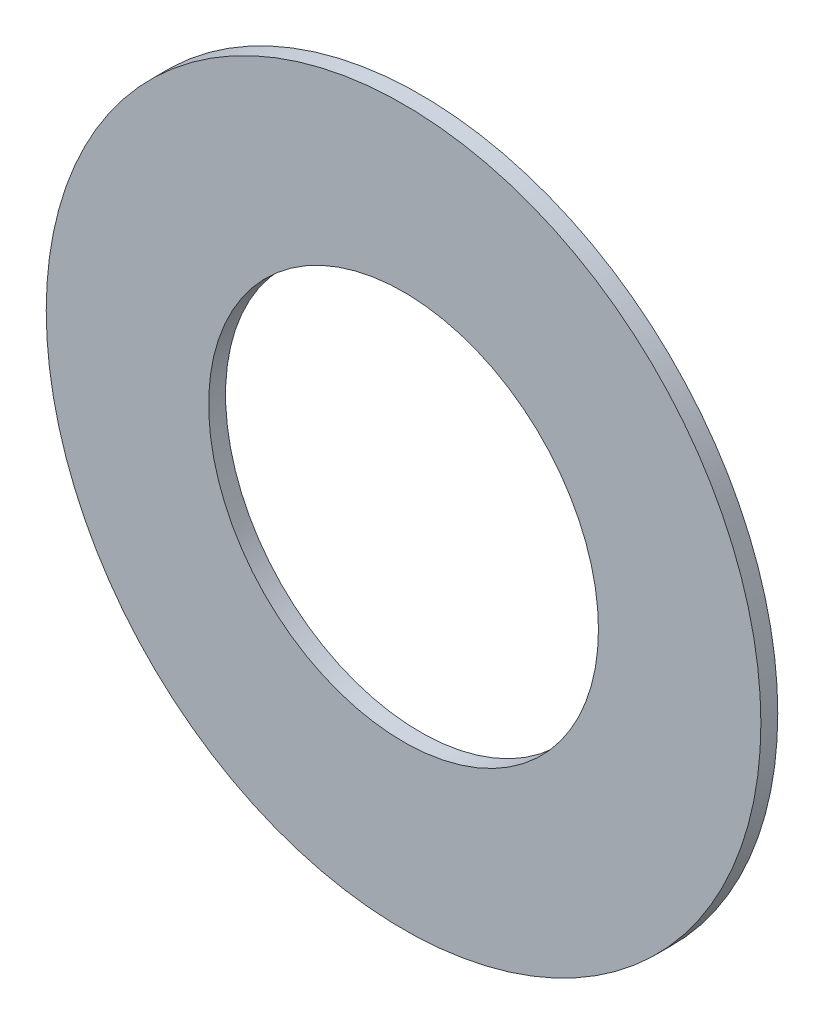
ISO-10303-21;
HEADER;
FILE_DESCRIPTION(('STEP AP214'),'2;1');
FILE_NAME('part.step','',(''),(''),'','','');
FILE_SCHEMA(('AUTOMOTIVE_DESIGN { 1 0 10303 214 1 1 1 1 }'));
ENDSEC;
DATA;
#1=APPLICATION_CONTEXT('core data for automotive mechanical design processes');
#2=APPLICATION_PROTOCOL_DEFINITION('international standard','automotive_design',2000,#1);
#3=PRODUCT_CONTEXT('',#1,'mechanical');
#4=PRODUCT('Part','Part','',(#3));
#5=PRODUCT_RELATED_PRODUCT_CATEGORY('part','',(#4));
#6=PRODUCT_DEFINITION_FORMATION('','',#4);
#7=PRODUCT_DEFINITION_CONTEXT('part definition',#1,'design');
#8=PRODUCT_DEFINITION('design','',#6,#7);
#9=PRODUCT_DEFINITION_SHAPE('','',#8);
#10=(LENGTH_UNIT() NAMED_UNIT(*) SI_UNIT(.MILLI.,.METRE.));
#11=(NAMED_UNIT(*) PLANE_ANGLE_UNIT() SI_UNIT($,.RADIAN.));
#12=(NAMED_UNIT(*) SI_UNIT($,.STERADIAN.) SOLID_ANGLE_UNIT());
#13=UNCERTAINTY_MEASURE_WITH_UNIT(LENGTH_MEASURE(1.E-05),#10,'distance_accuracy_value','');
#14=(GEOMETRIC_REPRESENTATION_CONTEXT(3) GLOBAL_UNCERTAINTY_ASSIGNED_CONTEXT((#13)) GLOBAL_UNIT_ASSIGNED_CONTEXT((#10,
#11,#12)) REPRESENTATION_CONTEXT('',''));
#15=CARTESIAN_POINT('',(0.,0.,0.));
#16=DIRECTION('',(0.,0.,1.));
#17=DIRECTION('',(1.,0.,0.));
#18=AXIS2_PLACEMENT_3D('',#15,#16,#17);
#19=CARTESIAN_POINT('',(0.,0.,0.2));
#20=DIRECTION('',(0.,0.,-1.));
#21=DIRECTION('',(-1.,0.,0.));
#22=AXIS2_PLACEMENT_3D('',#19,#20,#21);
#23=CYLINDRICAL_SURFACE('',#22,2.75);
#24=CARTESIAN_POINT('',(0.,0.,0.));
#25=DIRECTION('',(0.,0.,1.));
#26=DIRECTION('',(1.,0.,0.));
#27=AXIS2_PLACEMENT_3D('',#24,#25,#26);
#28=CIRCLE('',#27,2.75);
#29=CARTESIAN_POINT('',(2.75,0.,0.));
#30=VERTEX_POINT('',#29);
#31=EDGE_CURVE('E10',#30,#30,#28,.T.);
#32=ORIENTED_EDGE('',*,*,#31,.T.);
#33=EDGE_LOOP('',(#32));
#34=FACE_BOUND('',#33,.T.);
#35=CARTESIAN_POINT('',(0.,0.,0.13));
#36=DIRECTION('',(0.,0.,1.));
#37=DIRECTION('',(1.,0.,0.));
#38=AXIS2_PLACEMENT_3D('',#35,#36,#37);
#39=CIRCLE('',#38,2.75);
#40=CARTESIAN_POINT('',(2.75,0.,0.13));
#41=VERTEX_POINT('',#40);
#42=EDGE_CURVE('E42',#41,#41,#39,.T.);
#43=ORIENTED_EDGE('',*,*,#42,.F.);
#44=EDGE_LOOP('',(#43));
#45=FACE_BOUND('',#44,.T.);
#46=ADVANCED_FACE('F31',(#34,#45),#23,.T.);
#47=CARTESIAN_POINT('',(0.,0.,0.2));
#48=DIRECTION('',(0.,0.,-1.));
#49=DIRECTION('',(-1.,0.,0.));
#50=AXIS2_PLACEMENT_3D('',#47,#48,#49);
#51=CYLINDRICAL_SURFACE('',#50,1.5);
#52=CARTESIAN_POINT('',(0.,0.,0.));
#53=DIRECTION('',(0.,0.,1.));
#54=DIRECTION('',(1.,0.,0.));
#55=AXIS2_PLACEMENT_3D('',#52,#53,#54);
#56=CIRCLE('',#55,1.5);
#57=CARTESIAN_POINT('',(1.5,0.,0.));
#58=VERTEX_POINT('',#57);
#59=EDGE_CURVE('E38',#58,#58,#56,.T.);
#60=ORIENTED_EDGE('',*,*,#59,.F.);
#61=EDGE_LOOP('',(#60));
#62=FACE_BOUND('',#61,.T.);
#63=CARTESIAN_POINT('',(0.,0.,0.13));
#64=DIRECTION('',(0.,0.,1.));
#65=DIRECTION('',(1.,0.,0.));
#66=AXIS2_PLACEMENT_3D('',#63,#64,#65);
#67=CIRCLE('',#66,1.5);
#68=CARTESIAN_POINT('',(1.5,0.,0.13));
#69=VERTEX_POINT('',#68);
#70=EDGE_CURVE('E34',#69,#69,#67,.T.);
#71=ORIENTED_EDGE('',*,*,#70,.T.);
#72=EDGE_LOOP('',(#71));
#73=FACE_BOUND('',#72,.T.);
#74=ADVANCED_FACE('F51',(#62,#73),#51,.F.);
#75=CARTESIAN_POINT('',(0.,0.,0.));
#76=DIRECTION('',(0.,0.,1.));
#77=DIRECTION('',(1.,0.,0.));
#78=AXIS2_PLACEMENT_3D('',#75,#76,#77);
#79=PLANE('',#78);
#80=ORIENTED_EDGE('',*,*,#31,.F.);
#81=EDGE_LOOP('',(#80));
#82=FACE_BOUND('',#81,.T.);
#83=ORIENTED_EDGE('',*,*,#59,.T.);
#84=EDGE_LOOP('',(#83));
#85=FACE_BOUND('',#84,.T.);
#86=ADVANCED_FACE('F55',(#82,#85),#79,.F.);
#87=CARTESIAN_POINT('',(0.,0.,0.13));
#88=DIRECTION('',(0.,0.,1.));
#89=DIRECTION('',(1.,0.,0.));
#90=AXIS2_PLACEMENT_3D('',#87,#88,#89);
#91=PLANE('',#90);
#92=ORIENTED_EDGE('',*,*,#70,.F.);
#93=EDGE_LOOP('',(#92));
#94=FACE_BOUND('',#93,.T.);
#95=ORIENTED_EDGE('',*,*,#42,.T.);
#96=EDGE_LOOP('',(#95));
#97=FACE_BOUND('',#96,.T.);
#98=ADVANCED_FACE('F53',(#94,#97),#91,.T.);
#99=CLOSED_SHELL('',(#46,#74,#86,#98));
#100=MANIFOLD_SOLID_BREP('B2',#99);
#101=ADVANCED_BREP_SHAPE_REPRESENTATION('',(#18,#100),#14);
#102=SHAPE_DEFINITION_REPRESENTATION(#9,#101);
ENDSEC;
END-ISO-10303-21;
